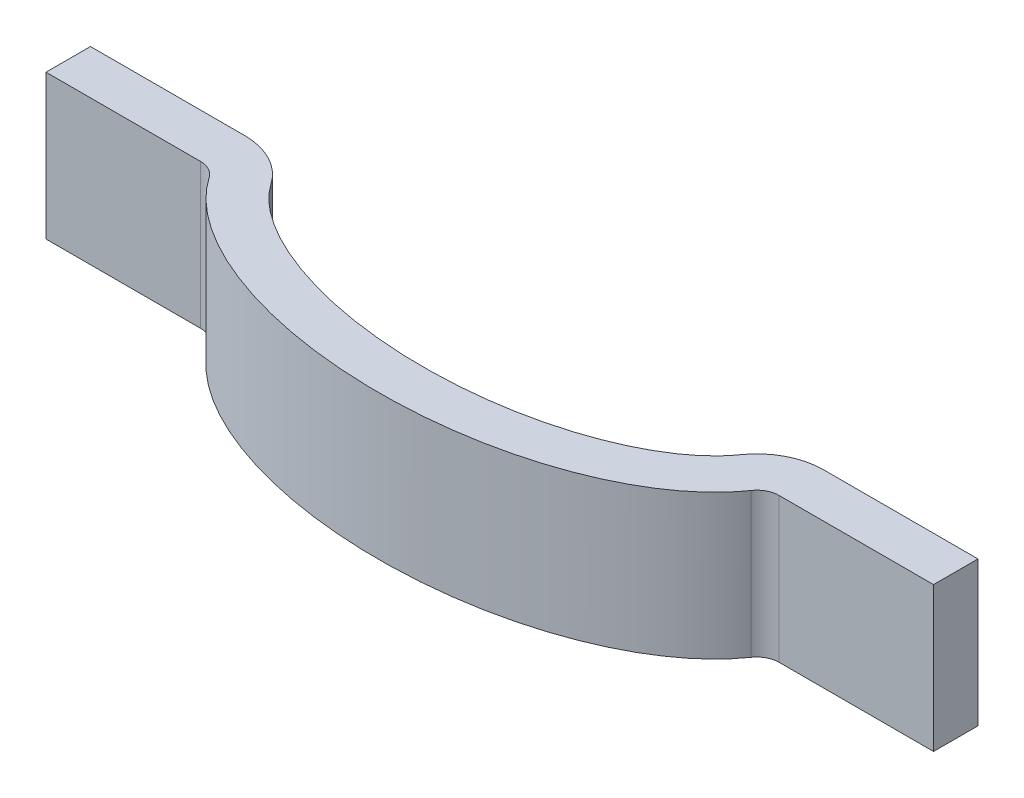
ISO-10303-21;
HEADER;
FILE_DESCRIPTION(('STEP AP214'),'2;1');
FILE_NAME('part.step','',(''),(''),'','','');
FILE_SCHEMA(('AUTOMOTIVE_DESIGN { 1 0 10303 214 1 1 1 1 }'));
ENDSEC;
DATA;
#1=APPLICATION_CONTEXT('core data for automotive mechanical design processes');
#2=APPLICATION_PROTOCOL_DEFINITION('international standard','automotive_design',2000,#1);
#3=PRODUCT_CONTEXT('',#1,'mechanical');
#4=PRODUCT('Part','Part','',(#3));
#5=PRODUCT_RELATED_PRODUCT_CATEGORY('part','',(#4));
#6=PRODUCT_DEFINITION_FORMATION('','',#4);
#7=PRODUCT_DEFINITION_CONTEXT('part definition',#1,'design');
#8=PRODUCT_DEFINITION('design','',#6,#7);
#9=PRODUCT_DEFINITION_SHAPE('','',#8);
#10=(LENGTH_UNIT() NAMED_UNIT(*) SI_UNIT(.MILLI.,.METRE.));
#11=(NAMED_UNIT(*) PLANE_ANGLE_UNIT() SI_UNIT($,.RADIAN.));
#12=(NAMED_UNIT(*) SI_UNIT($,.STERADIAN.) SOLID_ANGLE_UNIT());
#13=UNCERTAINTY_MEASURE_WITH_UNIT(LENGTH_MEASURE(1.E-05),#10,'distance_accuracy_value','');
#14=(GEOMETRIC_REPRESENTATION_CONTEXT(3) GLOBAL_UNCERTAINTY_ASSIGNED_CONTEXT((#13)) GLOBAL_UNIT_ASSIGNED_CONTEXT((#10,
#11,#12)) REPRESENTATION_CONTEXT('',''));
#15=CARTESIAN_POINT('',(0.,0.,0.));
#16=DIRECTION('',(0.,0.,1.));
#17=DIRECTION('',(1.,0.,0.));
#18=AXIS2_PLACEMENT_3D('',#15,#16,#17);
#19=CARTESIAN_POINT('',(16.8897912138371,9.49999999497035,10.9999999950296));
#20=DIRECTION('',(0.,1.,0.));
#21=DIRECTION('',(-1.,0.,0.));
#22=AXIS2_PLACEMENT_3D('',#19,#20,#21);
#23=CYLINDRICAL_SURFACE('',#22,2.);
#24=DIRECTION('',(0.,-1.,0.));
#25=VECTOR('',#24,1.);
#26=CARTESIAN_POINT('',(16.8897912138371,-5.02963642956544E-09,8.99999999502961));
#27=LINE('',#26,#25);
#28=CARTESIAN_POINT('',(16.8897912138371,15.9999999949704,8.99999999502967));
#29=VERTEX_POINT('',#28);
#30=CARTESIAN_POINT('',(16.8897912138371,2.99999999999999,8.99999999502961));
#31=VERTEX_POINT('',#30);
#32=EDGE_CURVE('E183',#29,#31,#27,.T.);
#33=ORIENTED_EDGE('',*,*,#32,.T.);
#34=CARTESIAN_POINT('',(16.8897912138371,2.99999999999999,10.9999999950296));
#35=DIRECTION('',(0.,1.,0.));
#36=DIRECTION('',(-1.,0.,0.));
#37=AXIS2_PLACEMENT_3D('',#34,#35,#36);
#38=CIRCLE('',#37,2.);
#39=CARTESIAN_POINT('',(18.5374581917324,2.99999999999999,9.86633623096491));
#40=VERTEX_POINT('',#39);
#41=EDGE_CURVE('E269',#31,#40,#38,.F.);
#42=ORIENTED_EDGE('',*,*,#41,.T.);
#43=DIRECTION('',(0.,1.,0.));
#44=VECTOR('',#43,1.);
#45=CARTESIAN_POINT('',(18.5374581917217,-5.02965030735325E-09,9.86633623094938));
#46=LINE('',#45,#44);
#47=CARTESIAN_POINT('',(18.5374581917324,15.9999999949704,9.86633623096492));
#48=VERTEX_POINT('',#47);
#49=EDGE_CURVE('E274',#40,#48,#46,.T.);
#50=ORIENTED_EDGE('',*,*,#49,.T.);
#51=CARTESIAN_POINT('',(16.8897912138371,15.9999999949704,10.9999999950297));
#52=DIRECTION('',(0.,-1.,0.));
#53=DIRECTION('',(1.,0.,0.));
#54=AXIS2_PLACEMENT_3D('',#51,#52,#53);
#55=CIRCLE('',#54,2.);
#56=EDGE_CURVE('E192',#48,#29,#55,.F.);
#57=ORIENTED_EDGE('',*,*,#56,.T.);
#58=EDGE_LOOP('',(#33,#42,#50,#57));
#59=FACE_BOUND('',#58,.T.);
#60=ADVANCED_FACE('F37',(#59),#23,.F.);
#61=CARTESIAN_POINT('',(20.91618604,-5.02963642956544E-09,8.99999999502961));
#62=DIRECTION('',(0.,0.,1.));
#63=DIRECTION('',(-1.,0.,0.));
#64=AXIS2_PLACEMENT_3D('',#61,#62,#63);
#65=PLANE('',#64);
#66=DIRECTION('',(-1.,0.,0.));
#67=VECTOR('',#66,1.);
#68=CARTESIAN_POINT('',(20.91618604,2.99999999999999,8.99999999502962));
#69=LINE('',#68,#67);
#70=CARTESIAN_POINT('',(3.,2.99999999999999,8.99999999502964));
#71=VERTEX_POINT('',#70);
#72=EDGE_CURVE('E289',#31,#71,#69,.T.);
#73=ORIENTED_EDGE('',*,*,#72,.F.);
#74=ORIENTED_EDGE('',*,*,#32,.F.);
#75=DIRECTION('',(1.,0.,0.));
#76=VECTOR('',#75,1.);
#77=CARTESIAN_POINT('',(20.91618604,15.9999999949704,8.99999999502967));
#78=LINE('',#77,#76);
#79=CARTESIAN_POINT('',(3.,15.9999999949704,8.99999999502964));
#80=VERTEX_POINT('',#79);
#81=EDGE_CURVE('E58',#80,#29,#78,.T.);
#82=ORIENTED_EDGE('',*,*,#81,.F.);
#83=DIRECTION('',(0.,1.,0.));
#84=VECTOR('',#83,1.);
#85=CARTESIAN_POINT('',(3.,-5.02963523419511E-09,8.99999999502961));
#86=LINE('',#85,#84);
#87=EDGE_CURVE('E44',#71,#80,#86,.T.);
#88=ORIENTED_EDGE('',*,*,#87,.F.);
#89=EDGE_LOOP('',(#73,#74,#82,#88));
#90=FACE_BOUND('',#89,.T.);
#91=ADVANCED_FACE('F258',(#90),#65,.T.);
#92=CARTESIAN_POINT('',(68.9425808661629,9.49999999497035,10.9999999950296));
#93=DIRECTION('',(0.,1.,0.));
#94=DIRECTION('',(-1.,0.,0.));
#95=AXIS2_PLACEMENT_3D('',#92,#93,#94);
#96=CYLINDRICAL_SURFACE('',#95,2.);
#97=DIRECTION('',(0.,1.,0.));
#98=VECTOR('',#97,1.);
#99=CARTESIAN_POINT('',(67.294913888276,-5.02964336845935E-09,9.86633623095261));
#100=LINE('',#99,#98);
#101=CARTESIAN_POINT('',(67.2949138882676,15.9999999949703,9.86633623096491));
#102=VERTEX_POINT('',#101);
#103=CARTESIAN_POINT('',(67.2949138882676,3.,9.86633623096487));
#104=VERTEX_POINT('',#103);
#105=EDGE_CURVE('E197',#102,#104,#100,.F.);
#106=ORIENTED_EDGE('',*,*,#105,.T.);
#107=CARTESIAN_POINT('',(68.9425808661629,3.,10.9999999950296));
#108=DIRECTION('',(0.,1.,0.));
#109=DIRECTION('',(-1.,0.,0.));
#110=AXIS2_PLACEMENT_3D('',#107,#108,#109);
#111=CIRCLE('',#110,2.);
#112=CARTESIAN_POINT('',(68.9425808661629,3.,8.99999999502959));
#113=VERTEX_POINT('',#112);
#114=EDGE_CURVE('E152',#104,#113,#111,.F.);
#115=ORIENTED_EDGE('',*,*,#114,.T.);
#116=DIRECTION('',(0.,-1.,0.));
#117=VECTOR('',#116,1.);
#118=CARTESIAN_POINT('',(68.9425808661629,-5.02963642956544E-09,8.99999999502962));
#119=LINE('',#118,#117);
#120=CARTESIAN_POINT('',(68.9425808661629,15.9999999949703,8.99999999502963));
#121=VERTEX_POINT('',#120);
#122=EDGE_CURVE('E148',#113,#121,#119,.F.);
#123=ORIENTED_EDGE('',*,*,#122,.T.);
#124=CARTESIAN_POINT('',(68.9425808661629,15.9999999949703,10.9999999950296));
#125=DIRECTION('',(0.,-1.,0.));
#126=DIRECTION('',(1.,0.,0.));
#127=AXIS2_PLACEMENT_3D('',#124,#125,#126);
#128=CIRCLE('',#127,2.);
#129=EDGE_CURVE('E129',#121,#102,#128,.F.);
#130=ORIENTED_EDGE('',*,*,#129,.T.);
#131=EDGE_LOOP('',(#106,#115,#123,#130));
#132=FACE_BOUND('',#131,.T.);
#133=ADVANCED_FACE('F263',(#132),#96,.F.);
#134=CARTESIAN_POINT('',(64.91618604,-5.02963642956544E-09,8.99999999502962));
#135=DIRECTION('',(0.,0.,1.));
#136=DIRECTION('',(-1.,0.,0.));
#137=AXIS2_PLACEMENT_3D('',#134,#135,#136);
#138=PLANE('',#137);
#139=DIRECTION('',(-1.,0.,0.));
#140=VECTOR('',#139,1.);
#141=CARTESIAN_POINT('',(64.91618604,3.,8.99999999502963));
#142=LINE('',#141,#140);
#143=CARTESIAN_POINT('',(82.8323720749977,3.,8.99999999502965));
#144=VERTEX_POINT('',#143);
#145=EDGE_CURVE('E147',#144,#113,#142,.T.);
#146=ORIENTED_EDGE('',*,*,#145,.F.);
#147=DIRECTION('',(0.,-1.,0.));
#148=VECTOR('',#147,1.);
#149=CARTESIAN_POINT('',(82.8323720749977,-5.02963642956544E-09,8.99999999502961));
#150=LINE('',#149,#148);
#151=CARTESIAN_POINT('',(82.8323720749977,15.9999999949704,8.99999999502967));
#152=VERTEX_POINT('',#151);
#153=EDGE_CURVE('E11',#152,#144,#150,.T.);
#154=ORIENTED_EDGE('',*,*,#153,.F.);
#155=DIRECTION('',(1.,0.,0.));
#156=VECTOR('',#155,1.);
#157=CARTESIAN_POINT('',(64.91618604,15.9999999949703,8.99999999502967));
#158=LINE('',#157,#156);
#159=EDGE_CURVE('E123',#121,#152,#158,.T.);
#160=ORIENTED_EDGE('',*,*,#159,.F.);
#161=ORIENTED_EDGE('',*,*,#122,.F.);
#162=EDGE_LOOP('',(#146,#154,#160,#161));
#163=FACE_BOUND('',#162,.T.);
#164=ADVANCED_FACE('F146',(#163),#138,.T.);
#165=CARTESIAN_POINT('',(20.91618604,-5.02962255177763E-09,4.99999999502961));
#166=CARTESIAN_POINT('',(20.91618604,-5.02962255177763E-09,5.43203663686933));
#167=CARTESIAN_POINT('',(21.0612996780334,-5.02962255177763E-09,6.29610992054875));
#168=CARTESIAN_POINT('',(21.9187981969256,-5.02963642956544E-09,7.88664464208802));
#169=CARTESIAN_POINT('',(23.6581810932833,-5.02964336845935E-09,9.6693867916077));
#170=CARTESIAN_POINT('',(27.1749338723224,-5.02965030735325E-09,11.9987857519427));
#171=CARTESIAN_POINT('',(33.5518250020295,-5.02965724624715E-09,14.3281522537659));
#172=CARTESIAN_POINT('',(42.91618604,-5.02966418514106E-09,15.3359238656615));
#173=CARTESIAN_POINT('',(52.2805470779705,-5.02966418514106E-09,14.3281522537659));
#174=CARTESIAN_POINT('',(58.6574382076776,-5.02965030735325E-09,11.9987857519427));
#175=CARTESIAN_POINT('',(62.1741909867167,-5.02963642956544E-09,9.6693867916077));
#176=CARTESIAN_POINT('',(63.9135738830744,-5.02963642956544E-09,7.88664464208802));
#177=CARTESIAN_POINT('',(64.7710724019666,-5.02962255177763E-09,6.29610992054875));
#178=CARTESIAN_POINT('',(64.91618604,-5.02962255177763E-09,5.43203663686933));
#179=CARTESIAN_POINT('',(64.91618604,-5.02962255177763E-09,4.99999999502962));
#180=B_SPLINE_CURVE_WITH_KNOTS('',3,(#165,#166,#167,#168,#169,#170,#171,#172,#173,#174,#175,
#176,#177,#178,#179),.UNSPECIFIED.,.F.,.F.,(4,1,1,1,1,1,1,1,1,1,1,1,4),(3.14159265358979,
3.33794219443916,3.53429173528852,3.73064127613788,3.92699081698724,4.31968989868597,
4.71238898038469,5.10508806208341,5.49778714378214,5.6941366846315,5.89048622548086,
6.08683576633022,6.28318530717959),.UNSPECIFIED.);
#181=DIRECTION('',(0.,1.,0.));
#182=VECTOR('',#181,1.);
#183=SURFACE_OF_LINEAR_EXTRUSION('',#180,#182);
#184=OFFSET_SURFACE('',#183,4.,.F.);
#185=CARTESIAN_POINT('',(67.2949138882676,3.,9.86633623096487));
#186=CARTESIAN_POINT('',(67.1684440931066,3.,10.0502030135455));
#187=CARTESIAN_POINT('',(67.0363906796709,3.,10.2301440314707));
#188=CARTESIAN_POINT('',(66.7626468408219,3.,10.5820103308421));
#189=CARTESIAN_POINT('',(66.620974997312,3.,10.7539500441448));
#190=CARTESIAN_POINT('',(66.3291127520982,3.,11.0902550530924));
#191=CARTESIAN_POINT('',(66.1789266630438,3.,11.2546241083053));
#192=CARTESIAN_POINT('',(65.8724313172399,3.,11.5746100408212));
#193=CARTESIAN_POINT('',(65.7161921280537,3.,11.7302941816732));
#194=CARTESIAN_POINT('',(65.3970483231909,3.,12.0348203377828));
#195=CARTESIAN_POINT('',(65.2341405097192,3.,12.1836589960406));
#196=CARTESIAN_POINT('',(64.9023845100024,3.,12.4746420649206));
#197=CARTESIAN_POINT('',(64.7335345581745,3.,12.6167844560413));
#198=CARTESIAN_POINT('',(64.2514464556864,3.,13.0071405144468));
#199=CARTESIAN_POINT('',(63.9321481771395,3.,13.2479047347508));
#200=CARTESIAN_POINT('',(63.2795117624317,3.,13.7097134978813));
#201=CARTESIAN_POINT('',(62.9461676914851,3.,13.9307495794251));
#202=CARTESIAN_POINT('',(62.2679411757094,3.,14.3543866724914));
#203=CARTESIAN_POINT('',(61.9230574555743,3.,14.5569856371685));
#204=CARTESIAN_POINT('',(61.2210471929346,3.,14.9460497469424));
#205=CARTESIAN_POINT('',(60.8638496371084,3.,15.1323862668058));
#206=CARTESIAN_POINT('',(60.1414727278882,3.,15.4886168930814));
#207=CARTESIAN_POINT('',(59.776295065123,3.,15.6585144415647));
#208=CARTESIAN_POINT('',(59.0392700343087,3.,15.9832339756128));
#209=CARTESIAN_POINT('',(58.6674218096528,3.,16.1380540083331));
#210=CARTESIAN_POINT('',(57.7995477412056,3.,16.4803684463789));
#211=CARTESIAN_POINT('',(57.3014785566919,3.,16.6626897441269));
#212=CARTESIAN_POINT('',(56.2975311155487,3.,17.0045725848523));
#213=CARTESIAN_POINT('',(55.7916513731083,3.,17.1641297367609));
#214=CARTESIAN_POINT('',(54.7733151560886,3.,17.4616716407113));
#215=CARTESIAN_POINT('',(54.2608555736741,3.,17.5996457600311));
#216=CARTESIAN_POINT('',(53.4883395046693,3.,17.7909046867859));
#217=CARTESIAN_POINT('',(53.2301992293896,3.,17.8520400335823));
#218=CARTESIAN_POINT('',(52.7127456594417,3.,17.9691327831594));
#219=CARTESIAN_POINT('',(52.4534323617423,3.,18.0250901725522));
#220=CARTESIAN_POINT('',(51.6740585073555,3.,18.1854080267874));
#221=CARTESIAN_POINT('',(51.1524350318748,3.,18.28224593991));
#222=CARTESIAN_POINT('',(50.1060220544663,3.,18.4569080901237));
#223=CARTESIAN_POINT('',(49.5812324335895,3.,18.5347316082456));
#224=CARTESIAN_POINT('',(48.5293945254812,3.,18.6720785690793));
#225=CARTESIAN_POINT('',(48.0023467968509,3.,18.7316062995037));
#226=CARTESIAN_POINT('',(46.9465469458277,3.,18.8328564322404));
#227=CARTESIAN_POINT('',(46.417794836107,3.,18.8745789666297));
#228=CARTESIAN_POINT('',(45.5109740706491,3.,18.9309977924382));
#229=CARTESIAN_POINT('',(45.1331678550092,3.,18.9500130778416));
#230=CARTESIAN_POINT('',(44.3772180544103,3.,18.9791119253451));
#231=CARTESIAN_POINT('',(43.9990744785194,3.,18.9891957206831));
#232=CARTESIAN_POINT('',(43.2426266175703,3.,19.000374274344));
#233=CARTESIAN_POINT('',(42.8643223226806,3.,19.0014683665954));
#234=CARTESIAN_POINT('',(42.1077931008588,3.,18.9946425532552));
#235=CARTESIAN_POINT('',(41.7295681745753,3.,18.9867225766493));
#236=CARTESIAN_POINT('',(40.9733081320334,3.,18.9619440114931));
#237=CARTESIAN_POINT('',(40.5952730923841,3.,18.9450830605258));
#238=CARTESIAN_POINT('',(39.8397210572341,3.,18.9024129697075));
#239=CARTESIAN_POINT('',(39.4622040612316,3.,18.8766038385317));
#240=CARTESIAN_POINT('',(38.3322142249044,3.,18.7858088329513));
#241=CARTESIAN_POINT('',(37.5807477058313,3.,18.7074046774618));
#242=CARTESIAN_POINT('',(36.4573039340414,3.,18.5620741999557));
#243=CARTESIAN_POINT('',(36.0834720531697,3.,18.5090142055376));
#244=CARTESIAN_POINT('',(35.337266261916,3.,18.3933823845907));
#245=CARTESIAN_POINT('',(34.9648923580415,3.,18.3308105156573));
#246=CARTESIAN_POINT('',(34.2220947907623,3.,18.1958780133701));
#247=CARTESIAN_POINT('',(33.8516703253949,2.99999999999999,18.1235217961705));
#248=CARTESIAN_POINT('',(33.1129730195451,2.99999999999999,17.9685575512248));
#249=CARTESIAN_POINT('',(32.7447001364086,2.99999999999999,17.8859497274393));
#250=CARTESIAN_POINT('',(32.0686314967826,2.99999999999999,17.7240461221481));
#251=CARTESIAN_POINT('',(31.7604675275647,2.99999999999999,17.6462866528733));
#252=CARTESIAN_POINT('',(31.1461648461952,2.99999999999999,17.4831656550781));
#253=CARTESIAN_POINT('',(30.8400261260857,2.99999999999999,17.3978041564476));
#254=CARTESIAN_POINT('',(29.9250030969704,2.99999999999999,17.1300491601522));
#255=CARTESIAN_POINT('',(29.3194857725492,2.99999999999999,16.9359789373812));
#256=CARTESIAN_POINT('',(28.1193664685582,2.99999999999999,16.5144629301057));
#257=CARTESIAN_POINT('',(27.5247766758037,2.99999999999999,16.2869821580386));
#258=CARTESIAN_POINT('',(26.6444219391632,2.99999999999999,15.9184749630105));
#259=CARTESIAN_POINT('',(26.3529043883624,2.99999999999999,15.7910976627161));
#260=CARTESIAN_POINT('',(25.7742809160311,2.99999999999999,15.5266732937783));
#261=CARTESIAN_POINT('',(25.4871747874601,2.99999999999999,15.3896266806417));
#262=CARTESIAN_POINT('',(24.986079454977,2.99999999999999,15.1391845810809));
#263=CARTESIAN_POINT('',(24.7710047073359,2.99999999999999,15.0279579324538));
#264=CARTESIAN_POINT('',(24.3442429945969,2.99999999999999,14.7991804642747));
#265=CARTESIAN_POINT('',(24.1325559720853,2.99999999999999,14.681629752048));
#266=CARTESIAN_POINT('',(23.7128984861939,2.99999999999999,14.4399850157551));
#267=CARTESIAN_POINT('',(23.5049286546783,2.99999999999999,14.3158898931417));
#268=CARTESIAN_POINT('',(23.0931650592438,2.99999999999999,14.0609468096725));
#269=CARTESIAN_POINT('',(22.8893713121394,2.99999999999999,13.9300988216346));
#270=CARTESIAN_POINT('',(22.4874086234861,2.99999999999999,13.6620019360083));
#271=CARTESIAN_POINT('',(22.2892176950368,2.99999999999999,13.524786120459));
#272=CARTESIAN_POINT('',(21.8980811661594,2.99999999999999,13.2430954268313));
#273=CARTESIAN_POINT('',(21.7051357015843,2.99999999999999,13.0986203610198));
#274=CARTESIAN_POINT('',(21.1354199303817,2.99999999999999,12.6537953527266));
#275=CARTESIAN_POINT('',(20.767475547945,2.99999999999999,12.3418515561697));
#276=CARTESIAN_POINT('',(20.2409300098414,2.99999999999999,11.8517608390854));
#277=CARTESIAN_POINT('',(20.0707403664345,2.99999999999999,11.6859289569286));
#278=CARTESIAN_POINT('',(19.738792765326,2.99999999999999,11.346097215661));
#279=CARTESIAN_POINT('',(19.5770319678337,2.99999999999999,11.1721001455553));
#280=CARTESIAN_POINT('',(19.2623123002156,2.99999999999999,10.8147341263391));
#281=CARTESIAN_POINT('',(19.1094014988301,2.99999999999999,10.6313226567127));
#282=CARTESIAN_POINT('',(18.8146771516958,2.99999999999999,10.2555603950001));
#283=CARTESIAN_POINT('',(18.6728729416345,2.99999999999999,10.0632022947002));
#284=CARTESIAN_POINT('',(18.5374581917324,2.99999999999999,9.86633623096489));
#285=B_SPLINE_CURVE_WITH_KNOTS('',3,(#185,#186,#187,#188,#189,#190,#191,#192,#193,#194,#195,
#196,#197,#198,#199,#200,#201,#202,#203,#204,#205,#206,#207,#208,#209,#210,#211,#212,#213,#214,
#215,#216,#217,#218,#219,#220,#221,#222,#223,#224,#225,#226,#227,#228,#229,#230,#231,#232,#233,
#234,#235,#236,#237,#238,#239,#240,#241,#242,#243,#244,#245,#246,#247,#248,#249,#250,#251,#252,
#253,#254,#255,#256,#257,#258,#259,#260,#261,#262,#263,#264,#265,#266,#267,#268,#269,#270,#271,
#272,#273,#274,#275,#276,#277,#278,#279,#280,#281,#282,#283,#284),.UNSPECIFIED.,.F.,.F.,(4,2,2,
2,2,2,2,2,2,2,2,2,2,2,2,2,2,2,2,2,2,2,2,2,2,2,2,2,2,2,2,2,2,2,2,2,2,2,2,2,2,2,2,2,2,2,2,2,2,4),
(0.,0.669281806984418,1.33730552325058,2.00499384289205,2.66646274120828,3.32825263621456,
3.99024085666846,5.18901225671086,6.38829535658677,7.58771143603576,8.79588651027868,
10.003808061059,11.211885854719,12.8024289014461,14.3932783408854,15.9849090490023,
16.7807068771558,17.5765067628298,19.1677083788796,20.7589701518634,22.349858719549,
23.9407354859981,25.0754911165634,26.210217113122,27.3450271838467,28.4798461948418,
29.6149652014029,30.7500831074906,33.0156563363389,34.1483005989663,35.2809499111618,
36.4130896992206,37.5452069664283,38.4985792432365,39.4519477717131,41.3586042894407,
43.2672718873329,44.2215230770731,45.1757293434572,45.9020350132949,46.6283283609372,
47.3547440149406,48.0811625931855,48.8041567891258,49.5271696922066,50.9721395653798,
51.6847852079455,52.3971891772918,53.1131561977558,53.8297187086723),.UNSPECIFIED.);
#286=EDGE_CURVE('E156',#104,#40,#285,.T.);
#287=ORIENTED_EDGE('',*,*,#286,.F.);
#288=ORIENTED_EDGE('',*,*,#105,.F.);
#289=CARTESIAN_POINT('',(18.5374581917324,15.9999999949704,9.86633623096493));
#290=CARTESIAN_POINT('',(18.6639279868934,15.9999999949704,10.0502030135455));
#291=CARTESIAN_POINT('',(18.7959814003291,15.9999999949704,10.2301440314708));
#292=CARTESIAN_POINT('',(19.0697252391781,15.9999999949704,10.5820103308422));
#293=CARTESIAN_POINT('',(19.211397082688,15.9999999949704,10.7539500441449));
#294=CARTESIAN_POINT('',(19.5032593279019,15.9999999949704,11.0902550530925));
#295=CARTESIAN_POINT('',(19.6534454169562,15.9999999949704,11.2546241083054));
#296=CARTESIAN_POINT('',(19.9599407627601,15.9999999949704,11.5746100408213));
#297=CARTESIAN_POINT('',(20.1161799519464,15.9999999949704,11.7302941816733));
#298=CARTESIAN_POINT('',(20.4353237568092,15.9999999949704,12.0348203377829));
#299=CARTESIAN_POINT('',(20.5982315702808,15.9999999949704,12.1836589960407));
#300=CARTESIAN_POINT('',(20.9299875699977,15.9999999949704,12.4746420649207));
#301=CARTESIAN_POINT('',(21.0988375218255,15.9999999949704,12.6167844560414));
#302=CARTESIAN_POINT('',(21.5809256243136,15.9999999949704,13.0071405144469));
#303=CARTESIAN_POINT('',(21.9002239028605,15.9999999949704,13.2479047347509));
#304=CARTESIAN_POINT('',(22.5528603175683,15.9999999949704,13.7097134978814));
#305=CARTESIAN_POINT('',(22.8862043885149,15.9999999949704,13.9307495794252));
#306=CARTESIAN_POINT('',(23.5644309042907,15.9999999949704,14.3543866724915));
#307=CARTESIAN_POINT('',(23.9093146244258,15.9999999949704,14.5569856371686));
#308=CARTESIAN_POINT('',(24.6113248870654,15.9999999949704,14.9460497469425));
#309=CARTESIAN_POINT('',(24.9685224428917,15.9999999949704,15.1323862668059));
#310=CARTESIAN_POINT('',(25.6908993521119,15.9999999949704,15.4886168930815));
#311=CARTESIAN_POINT('',(26.0560770148771,15.9999999949704,15.6585144415648));
#312=CARTESIAN_POINT('',(26.7931020456914,15.9999999949704,15.9832339756129));
#313=CARTESIAN_POINT('',(27.1649502703472,15.9999999949704,16.1380540083331));
#314=CARTESIAN_POINT('',(28.0328243387945,15.9999999949704,16.480368446379));
#315=CARTESIAN_POINT('',(28.5308935233082,15.9999999949704,16.662689744127));
#316=CARTESIAN_POINT('',(29.5348409644515,15.9999999949704,17.0045725848524));
#317=CARTESIAN_POINT('',(30.0407207068918,15.9999999949704,17.164129736761));
#318=CARTESIAN_POINT('',(31.0590569239116,15.9999999949704,17.4616716407113));
#319=CARTESIAN_POINT('',(31.571516506326,15.9999999949704,17.5996457600312));
#320=CARTESIAN_POINT('',(32.3440325753309,15.9999999949704,17.790904686786));
#321=CARTESIAN_POINT('',(32.6021728506105,15.9999999949704,17.8520400335823));
#322=CARTESIAN_POINT('',(33.1196264205585,15.9999999949704,17.9691327831594));
#323=CARTESIAN_POINT('',(33.3789397182578,15.9999999949704,18.0250901725523));
#324=CARTESIAN_POINT('',(34.1583135726446,15.9999999949704,18.1854080267875));
#325=CARTESIAN_POINT('',(34.6799370481254,15.9999999949704,18.2822459399101));
#326=CARTESIAN_POINT('',(35.7263500255338,15.9999999949704,18.4569080901238));
#327=CARTESIAN_POINT('',(36.2511396464107,15.9999999949704,18.5347316082457));
#328=CARTESIAN_POINT('',(37.302977554519,15.9999999949704,18.6720785690793));
#329=CARTESIAN_POINT('',(37.8300252831492,15.9999999949704,18.7316062995037));
#330=CARTESIAN_POINT('',(38.8858251341724,15.9999999949704,18.8328564322405));
#331=CARTESIAN_POINT('',(39.4145772438932,15.9999999949704,18.8745789666298));
#332=CARTESIAN_POINT('',(40.3213980093511,15.9999999949704,18.9309977924382));
#333=CARTESIAN_POINT('',(40.699204224991,15.9999999949704,18.9500130778417));
#334=CARTESIAN_POINT('',(41.4551540255898,15.9999999949704,18.9791119253451));
#335=CARTESIAN_POINT('',(41.8332976014808,15.9999999949704,18.9891957206831));
#336=CARTESIAN_POINT('',(42.5897454624299,15.9999999949704,19.000374274344));
#337=CARTESIAN_POINT('',(42.9680497573195,15.9999999949704,19.0014683665955));
#338=CARTESIAN_POINT('',(43.7245789791414,15.9999999949704,18.9946425532552));
#339=CARTESIAN_POINT('',(44.1028039054249,15.9999999949704,18.9867225766493));
#340=CARTESIAN_POINT('',(44.8590639479668,15.9999999949704,18.9619440114932));
#341=CARTESIAN_POINT('',(45.2370989876162,15.9999999949704,18.9450830605258));
#342=CARTESIAN_POINT('',(45.9926510227661,15.9999999949704,18.9024129697075));
#343=CARTESIAN_POINT('',(46.3701680187686,15.9999999949704,18.8766038385317));
#344=CARTESIAN_POINT('',(47.5001578550959,15.9999999949704,18.7858088329513));
#345=CARTESIAN_POINT('',(48.251624374169,15.9999999949704,18.7074046774618));
#346=CARTESIAN_POINT('',(49.3750681459588,15.9999999949704,18.5620741999557));
#347=CARTESIAN_POINT('',(49.7489000268305,15.9999999949704,18.5090142055376));
#348=CARTESIAN_POINT('',(50.4951058180842,15.9999999949704,18.3933823845907));
#349=CARTESIAN_POINT('',(50.8674797219588,15.9999999949704,18.3308105156573));
#350=CARTESIAN_POINT('',(51.6102772892379,15.9999999949704,18.1958780133701));
#351=CARTESIAN_POINT('',(51.9807017546054,15.9999999949704,18.1235217961705));
#352=CARTESIAN_POINT('',(52.7193990604552,15.9999999949704,17.9685575512247));
#353=CARTESIAN_POINT('',(53.0876719435916,15.9999999949704,17.8859497274392));
#354=CARTESIAN_POINT('',(53.7637405832177,15.9999999949704,17.7240461221481));
#355=CARTESIAN_POINT('',(54.0719045524356,15.9999999949704,17.6462866528732));
#356=CARTESIAN_POINT('',(54.6862072338051,15.9999999949704,17.483165655078));
#357=CARTESIAN_POINT('',(54.9923459539146,15.9999999949703,17.3978041564475));
#358=CARTESIAN_POINT('',(55.9073689830299,15.9999999949703,17.1300491601521));
#359=CARTESIAN_POINT('',(56.5128863074511,15.9999999949703,16.9359789373812));
#360=CARTESIAN_POINT('',(57.7130056114421,15.9999999949703,16.5144629301056));
#361=CARTESIAN_POINT('',(58.3075954041965,15.9999999949703,16.2869821580385));
#362=CARTESIAN_POINT('',(59.1879501408371,15.9999999949703,15.9184749630104));
#363=CARTESIAN_POINT('',(59.4794676916379,15.9999999949703,15.791097662716));
#364=CARTESIAN_POINT('',(60.0580911639692,15.9999999949703,15.5266732937782));
#365=CARTESIAN_POINT('',(60.3451972925402,15.9999999949703,15.3896266806416));
#366=CARTESIAN_POINT('',(60.8462926250233,15.9999999949703,15.1391845810808));
#367=CARTESIAN_POINT('',(61.0613673726644,15.9999999949703,15.0279579324537));
#368=CARTESIAN_POINT('',(61.4881290854034,15.9999999949703,14.7991804642746));
#369=CARTESIAN_POINT('',(61.699816107915,15.9999999949703,14.6816297520478));
#370=CARTESIAN_POINT('',(62.1194735938064,15.9999999949703,14.439985015755));
#371=CARTESIAN_POINT('',(62.3274434253219,15.9999999949703,14.3158898931415));
#372=CARTESIAN_POINT('',(62.7392070207564,15.9999999949703,14.0609468096723));
#373=CARTESIAN_POINT('',(62.9430007678608,15.9999999949703,13.9300988216345));
#374=CARTESIAN_POINT('',(63.3449634565141,15.9999999949703,13.6620019360082));
#375=CARTESIAN_POINT('',(63.5431543849634,15.9999999949703,13.5247861204589));
#376=CARTESIAN_POINT('',(63.9342909138408,15.9999999949703,13.2430954268311));
#377=CARTESIAN_POINT('',(64.1272363784159,15.9999999949703,13.0986203610196));
#378=CARTESIAN_POINT('',(64.6969521496185,15.9999999949703,12.6537953527265));
#379=CARTESIAN_POINT('',(65.0648965320551,15.9999999949703,12.3418515561695));
#380=CARTESIAN_POINT('',(65.5914420701588,15.9999999949703,11.8517608390852));
#381=CARTESIAN_POINT('',(65.7616317135656,15.9999999949703,11.6859289569285));
#382=CARTESIAN_POINT('',(66.0935793146741,15.9999999949703,11.3460972156609));
#383=CARTESIAN_POINT('',(66.2553401121664,15.9999999949703,11.1721001455552));
#384=CARTESIAN_POINT('',(66.5700597797844,15.9999999949703,10.814734126339));
#385=CARTESIAN_POINT('',(66.7229705811699,15.9999999949703,10.6313226567127));
#386=CARTESIAN_POINT('',(67.0176949283042,15.9999999949703,10.2555603950002));
#387=CARTESIAN_POINT('',(67.1594991383654,15.9999999949703,10.0632022947002));
#388=CARTESIAN_POINT('',(67.2949138882676,15.9999999949703,9.86633623096498));
#389=B_SPLINE_CURVE_WITH_KNOTS('',3,(#289,#290,#291,#292,#293,#294,#295,#296,#297,#298,#299,
#300,#301,#302,#303,#304,#305,#306,#307,#308,#309,#310,#311,#312,#313,#314,#315,#316,#317,#318,
#319,#320,#321,#322,#323,#324,#325,#326,#327,#328,#329,#330,#331,#332,#333,#334,#335,#336,#337,
#338,#339,#340,#341,#342,#343,#344,#345,#346,#347,#348,#349,#350,#351,#352,#353,#354,#355,#356,
#357,#358,#359,#360,#361,#362,#363,#364,#365,#366,#367,#368,#369,#370,#371,#372,#373,#374,#375,
#376,#377,#378,#379,#380,#381,#382,#383,#384,#385,#386,#387,#388),.UNSPECIFIED.,.F.,.F.,(4,2,2,
2,2,2,2,2,2,2,2,2,2,2,2,2,2,2,2,2,2,2,2,2,2,2,2,2,2,2,2,2,2,2,2,2,2,2,2,2,2,2,2,2,2,2,2,2,2,4),
(0.,0.66928180698443,1.33730552325061,2.00499384289208,2.66646274120832,3.32825263621462,
3.99024085666853,5.18901225671091,6.38829535658684,7.58771143603583,8.79588651027875,
10.0038080610591,11.2118858547191,12.8024289014462,14.3932783408855,15.9849090490024,
16.780706877156,17.5765067628299,19.1677083788798,20.7589701518636,22.3498587195491,
23.9407354859983,25.0754911165636,26.2102171131222,27.3450271838469,28.479846194842,
29.6149652014032,30.7500831074908,33.0156563363391,34.1483005989665,35.2809499111621,
36.4130896992208,37.5452069664286,38.4985792432368,39.4519477717134,41.358604289441,
43.2672718873332,44.2215230770734,45.1757293434575,45.9020350132952,46.6283283609375,
47.3547440149409,48.0811625931857,48.8041567891261,49.5271696922068,50.97213956538,
51.6847852079457,52.3971891772919,53.1131561977558,53.8297187086723),.UNSPECIFIED.);
#390=EDGE_CURVE('E225',#48,#102,#389,.T.);
#391=ORIENTED_EDGE('',*,*,#390,.F.);
#392=ORIENTED_EDGE('',*,*,#49,.F.);
#393=EDGE_LOOP('',(#287,#288,#391,#392));
#394=FACE_BOUND('',#393,.T.);
#395=ADVANCED_FACE('F212',(#394),#184,.T.);
#396=CARTESIAN_POINT('',(82.8323720749977,15.9999999949704,4.99999999502958));
#397=DIRECTION('',(-1.,0.,0.));
#398=DIRECTION('',(0.,0.,1.));
#399=AXIS2_PLACEMENT_3D('',#396,#397,#398);
#400=PLANE('',#399);
#401=DIRECTION('',(0.,0.,-1.));
#402=VECTOR('',#401,1.);
#403=CARTESIAN_POINT('',(82.8323720749977,15.9999999949704,4.99999999502958));
#404=LINE('',#403,#402);
#405=CARTESIAN_POINT('',(82.8323720749977,15.9999999949704,4.99999999502967));
#406=VERTEX_POINT('',#405);
#407=EDGE_CURVE('E126',#152,#406,#404,.T.);
#408=ORIENTED_EDGE('',*,*,#407,.F.);
#409=ORIENTED_EDGE('',*,*,#153,.T.);
#410=DIRECTION('',(0.,0.,-1.));
#411=VECTOR('',#410,1.);
#412=CARTESIAN_POINT('',(82.8323720749977,3.,4.99999999502958));
#413=LINE('',#412,#411);
#414=CARTESIAN_POINT('',(82.8323720749977,3.,4.99999999502965));
#415=VERTEX_POINT('',#414);
#416=EDGE_CURVE('E142',#144,#415,#413,.T.);
#417=ORIENTED_EDGE('',*,*,#416,.T.);
#418=DIRECTION('',(0.,-1.,0.));
#419=VECTOR('',#418,1.);
#420=CARTESIAN_POINT('',(82.8323720749977,-5.02962255177763E-09,4.99999999502962));
#421=LINE('',#420,#419);
#422=EDGE_CURVE('E141',#406,#415,#421,.T.);
#423=ORIENTED_EDGE('',*,*,#422,.F.);
#424=EDGE_LOOP('',(#408,#409,#417,#423));
#425=FACE_BOUND('',#424,.T.);
#426=ADVANCED_FACE('F137',(#425),#400,.F.);
#427=CARTESIAN_POINT('',(3.,2.99999999999999,4.99999999502958));
#428=DIRECTION('',(1.,0.,0.));
#429=DIRECTION('',(0.,1.,0.));
#430=AXIS2_PLACEMENT_3D('',#427,#428,#429);
#431=PLANE('',#430);
#432=DIRECTION('',(0.,0.,-1.));
#433=VECTOR('',#432,1.);
#434=CARTESIAN_POINT('',(3.,2.99999999999999,4.99999999502958));
#435=LINE('',#434,#433);
#436=CARTESIAN_POINT('',(3.,2.99999999999999,4.99999999502965));
#437=VERTEX_POINT('',#436);
#438=EDGE_CURVE('E283',#71,#437,#435,.T.);
#439=ORIENTED_EDGE('',*,*,#438,.F.);
#440=ORIENTED_EDGE('',*,*,#87,.T.);
#441=DIRECTION('',(0.,0.,-1.));
#442=VECTOR('',#441,1.);
#443=CARTESIAN_POINT('',(3.,15.9999999949704,4.99999999502958));
#444=LINE('',#443,#442);
#445=CARTESIAN_POINT('',(3.,15.9999999949704,4.99999999502965));
#446=VERTEX_POINT('',#445);
#447=EDGE_CURVE('E143',#80,#446,#444,.T.);
#448=ORIENTED_EDGE('',*,*,#447,.T.);
#449=DIRECTION('',(0.,1.,0.));
#450=VECTOR('',#449,1.);
#451=CARTESIAN_POINT('',(3.,-5.02962135640731E-09,4.99999999502961));
#452=LINE('',#451,#450);
#453=EDGE_CURVE('E175',#437,#446,#452,.T.);
#454=ORIENTED_EDGE('',*,*,#453,.F.);
#455=EDGE_LOOP('',(#439,#440,#448,#454));
#456=FACE_BOUND('',#455,.T.);
#457=ADVANCED_FACE('F238',(#456),#431,.F.);
#458=CARTESIAN_POINT('',(82.8323720749977,3.,4.99999999502958));
#459=DIRECTION('',(0.,1.,0.));
#460=DIRECTION('',(-1.,0.,0.));
#461=AXIS2_PLACEMENT_3D('',#458,#459,#460);
#462=PLANE('',#461);
#463=ORIENTED_EDGE('',*,*,#416,.F.);
#464=ORIENTED_EDGE('',*,*,#145,.T.);
#465=ORIENTED_EDGE('',*,*,#114,.F.);
#466=ORIENTED_EDGE('',*,*,#286,.T.);
#467=ORIENTED_EDGE('',*,*,#41,.F.);
#468=ORIENTED_EDGE('',*,*,#72,.T.);
#469=ORIENTED_EDGE('',*,*,#438,.T.);
#470=DIRECTION('',(-1.,0.,0.));
#471=VECTOR('',#470,1.);
#472=CARTESIAN_POINT('',(20.91618604,2.99999999999999,4.99999999502962));
#473=LINE('',#472,#471);
#474=CARTESIAN_POINT('',(16.8897912138371,2.99999999999999,4.99999999502961));
#475=VERTEX_POINT('',#474);
#476=EDGE_CURVE('E154',#475,#437,#473,.T.);
#477=ORIENTED_EDGE('',*,*,#476,.F.);
#478=CARTESIAN_POINT('',(16.8897912138371,2.99999999999999,10.9999999950296));
#479=DIRECTION('',(0.,1.,0.));
#480=DIRECTION('',(-1.,0.,0.));
#481=AXIS2_PLACEMENT_3D('',#478,#479,#480);
#482=CIRCLE('',#481,6.);
#483=CARTESIAN_POINT('',(21.832792147523,2.99999999999999,7.59900870283549));
#484=VERTEX_POINT('',#483);
#485=EDGE_CURVE('E151',#475,#484,#482,.F.);
#486=ORIENTED_EDGE('',*,*,#485,.T.);
#487=CARTESIAN_POINT('',(20.91618604,3.00000000000001,4.99999999502962));
#488=CARTESIAN_POINT('',(20.91618604,3.00000000000001,5.43203663686934));
#489=CARTESIAN_POINT('',(21.0612996780334,3.00000000000001,6.29610992054876));
#490=CARTESIAN_POINT('',(21.9187981969256,2.99999999999999,7.88664464208803));
#491=CARTESIAN_POINT('',(23.6581810932833,2.99999999999999,9.66938679160771));
#492=CARTESIAN_POINT('',(27.1749338723224,2.99999999999998,11.9987857519427));
#493=CARTESIAN_POINT('',(33.5518250020295,2.99999999999997,14.3281522537659));
#494=CARTESIAN_POINT('',(42.91618604,2.99999999999997,15.3359238656615));
#495=CARTESIAN_POINT('',(52.2805470779705,2.99999999999997,14.3281522537659));
#496=CARTESIAN_POINT('',(58.6574382076776,2.99999999999998,11.9987857519427));
#497=CARTESIAN_POINT('',(62.1741909867167,2.99999999999999,9.66938679160771));
#498=CARTESIAN_POINT('',(63.9135738830744,2.99999999999999,7.88664464208803));
#499=CARTESIAN_POINT('',(64.7710724019666,3.00000000000001,6.29610992054876));
#500=CARTESIAN_POINT('',(64.91618604,3.00000000000001,5.43203663686934));
#501=CARTESIAN_POINT('',(64.91618604,3.00000000000001,4.99999999502963));
#502=B_SPLINE_CURVE_WITH_KNOTS('',3,(#487,#488,#489,#490,#491,#492,#493,#494,#495,#496,#497,
#498,#499,#500,#501),.UNSPECIFIED.,.F.,.F.,(4,1,1,1,1,1,1,1,1,1,1,1,4),(3.14159265358979,
3.33794219443916,3.53429173528852,3.73064127613788,3.92699081698724,4.31968989868597,
4.71238898038469,5.10508806208341,5.49778714378214,5.6941366846315,5.89048622548086,
6.08683576633022,6.28318530717959),.UNSPECIFIED.);
#503=CARTESIAN_POINT('',(63.999579932477,3.,7.59900870283547));
#504=VERTEX_POINT('',#503);
#505=EDGE_CURVE('E162',#504,#484,#502,.F.);
#506=ORIENTED_EDGE('',*,*,#505,.F.);
#507=CARTESIAN_POINT('',(68.9425808661629,3.,10.9999999950296));
#508=DIRECTION('',(0.,1.,0.));
#509=DIRECTION('',(-1.,0.,0.));
#510=AXIS2_PLACEMENT_3D('',#507,#508,#509);
#511=CIRCLE('',#510,6.);
#512=CARTESIAN_POINT('',(68.9425808661629,3.,4.99999999502959));
#513=VERTEX_POINT('',#512);
#514=EDGE_CURVE('E167',#504,#513,#511,.F.);
#515=ORIENTED_EDGE('',*,*,#514,.T.);
#516=DIRECTION('',(-1.,0.,0.));
#517=VECTOR('',#516,1.);
#518=CARTESIAN_POINT('',(64.91618604,3.,4.99999999502963));
#519=LINE('',#518,#517);
#520=EDGE_CURVE('E172',#415,#513,#519,.T.);
#521=ORIENTED_EDGE('',*,*,#520,.F.);
#522=EDGE_LOOP('',(#463,#464,#465,#466,#467,#468,#469,#477,#486,#506,#515,#521));
#523=FACE_BOUND('',#522,.T.);
#524=ADVANCED_FACE('F237',(#523),#462,.F.);
#525=CARTESIAN_POINT('',(3.,15.9999999949704,4.99999999502958));
#526=DIRECTION('',(0.,-1.,0.));
#527=DIRECTION('',(1.,0.,0.));
#528=AXIS2_PLACEMENT_3D('',#525,#526,#527);
#529=PLANE('',#528);
#530=CARTESIAN_POINT('',(68.9425808661629,15.9999999949703,10.9999999950296));
#531=DIRECTION('',(0.,-1.,0.));
#532=DIRECTION('',(1.,0.,0.));
#533=AXIS2_PLACEMENT_3D('',#530,#531,#532);
#534=CIRCLE('',#533,6.);
#535=CARTESIAN_POINT('',(68.9425808661629,15.9999999949703,4.99999999502963));
#536=VERTEX_POINT('',#535);
#537=CARTESIAN_POINT('',(63.999579932477,15.9999999949704,7.59900870283549));
#538=VERTEX_POINT('',#537);
#539=EDGE_CURVE('E295',#536,#538,#534,.F.);
#540=ORIENTED_EDGE('',*,*,#539,.T.);
#541=CARTESIAN_POINT('',(20.91618604,15.9999999949704,4.99999999502967));
#542=CARTESIAN_POINT('',(20.91618604,15.9999999949704,5.43203663686938));
#543=CARTESIAN_POINT('',(21.0612996780334,15.9999999949704,6.29610992054881));
#544=CARTESIAN_POINT('',(21.9187981969256,15.9999999949704,7.88664464208808));
#545=CARTESIAN_POINT('',(23.6581810932833,15.9999999949704,9.66938679160775));
#546=CARTESIAN_POINT('',(27.1749338723224,15.9999999949704,11.9987857519428));
#547=CARTESIAN_POINT('',(33.5518250020295,15.9999999949703,14.328152253766));
#548=CARTESIAN_POINT('',(42.91618604,15.9999999949703,15.3359238656615));
#549=CARTESIAN_POINT('',(52.2805470779705,15.9999999949703,14.328152253766));
#550=CARTESIAN_POINT('',(58.6574382076776,15.9999999949704,11.9987857519428));
#551=CARTESIAN_POINT('',(62.1741909867167,15.9999999949704,9.66938679160775));
#552=CARTESIAN_POINT('',(63.9135738830744,15.9999999949704,7.88664464208808));
#553=CARTESIAN_POINT('',(64.7710724019666,15.9999999949704,6.29610992054881));
#554=CARTESIAN_POINT('',(64.91618604,15.9999999949704,5.43203663686938));
#555=CARTESIAN_POINT('',(64.91618604,15.9999999949704,4.99999999502967));
#556=B_SPLINE_CURVE_WITH_KNOTS('',3,(#541,#542,#543,#544,#545,#546,#547,#548,#549,#550,#551,
#552,#553,#554,#555),.UNSPECIFIED.,.F.,.F.,(4,1,1,1,1,1,1,1,1,1,1,1,4),(3.14159265358979,
3.33794219443916,3.53429173528852,3.73064127613788,3.92699081698724,4.31968989868597,
4.71238898038469,5.10508806208341,5.49778714378214,5.6941366846315,5.89048622548086,
6.08683576633022,6.28318530717959),.UNSPECIFIED.);
#557=CARTESIAN_POINT('',(21.832792147523,15.9999999949704,7.59900870283553));
#558=VERTEX_POINT('',#557);
#559=EDGE_CURVE('E51',#558,#538,#556,.T.);
#560=ORIENTED_EDGE('',*,*,#559,.F.);
#561=CARTESIAN_POINT('',(16.8897912138371,15.9999999949704,10.9999999950297));
#562=DIRECTION('',(0.,-1.,0.));
#563=DIRECTION('',(1.,0.,0.));
#564=AXIS2_PLACEMENT_3D('',#561,#562,#563);
#565=CIRCLE('',#564,6.);
#566=CARTESIAN_POINT('',(16.8897912138371,15.9999999949704,4.99999999502965));
#567=VERTEX_POINT('',#566);
#568=EDGE_CURVE('E134',#558,#567,#565,.F.);
#569=ORIENTED_EDGE('',*,*,#568,.T.);
#570=DIRECTION('',(1.,0.,0.));
#571=VECTOR('',#570,1.);
#572=CARTESIAN_POINT('',(20.91618604,15.9999999949704,4.99999999502967));
#573=LINE('',#572,#571);
#574=EDGE_CURVE('E285',#446,#567,#573,.T.);
#575=ORIENTED_EDGE('',*,*,#574,.F.);
#576=ORIENTED_EDGE('',*,*,#447,.F.);
#577=ORIENTED_EDGE('',*,*,#81,.T.);
#578=ORIENTED_EDGE('',*,*,#56,.F.);
#579=ORIENTED_EDGE('',*,*,#390,.T.);
#580=ORIENTED_EDGE('',*,*,#129,.F.);
#581=ORIENTED_EDGE('',*,*,#159,.T.);
#582=ORIENTED_EDGE('',*,*,#407,.T.);
#583=DIRECTION('',(1.,0.,0.));
#584=VECTOR('',#583,1.);
#585=CARTESIAN_POINT('',(64.91618604,15.9999999949703,4.99999999502967));
#586=LINE('',#585,#584);
#587=EDGE_CURVE('E296',#536,#406,#586,.T.);
#588=ORIENTED_EDGE('',*,*,#587,.F.);
#589=EDGE_LOOP('',(#540,#560,#569,#575,#576,#577,#578,#579,#580,#581,#582,#588));
#590=FACE_BOUND('',#589,.T.);
#591=ADVANCED_FACE('F125',(#590),#529,.F.);
#592=CARTESIAN_POINT('',(20.91618604,-5.02962255177763E-09,4.99999999502961));
#593=CARTESIAN_POINT('',(20.91618604,-5.02962255177763E-09,5.43203663686933));
#594=CARTESIAN_POINT('',(21.0612996780334,-5.02962255177763E-09,6.29610992054875));
#595=CARTESIAN_POINT('',(21.9187981969256,-5.02963642956544E-09,7.88664464208802));
#596=CARTESIAN_POINT('',(23.6581810932833,-5.02964336845935E-09,9.6693867916077));
#597=CARTESIAN_POINT('',(27.1749338723224,-5.02965030735325E-09,11.9987857519427));
#598=CARTESIAN_POINT('',(33.5518250020295,-5.02965724624715E-09,14.3281522537659));
#599=CARTESIAN_POINT('',(42.91618604,-5.02966418514106E-09,15.3359238656615));
#600=CARTESIAN_POINT('',(52.2805470779705,-5.02966418514106E-09,14.3281522537659));
#601=CARTESIAN_POINT('',(58.6574382076776,-5.02965030735325E-09,11.9987857519427));
#602=CARTESIAN_POINT('',(62.1741909867167,-5.02963642956544E-09,9.6693867916077));
#603=CARTESIAN_POINT('',(63.9135738830744,-5.02963642956544E-09,7.88664464208802));
#604=CARTESIAN_POINT('',(64.7710724019666,-5.02962255177763E-09,6.29610992054875));
#605=CARTESIAN_POINT('',(64.91618604,-5.02962255177763E-09,5.43203663686933));
#606=CARTESIAN_POINT('',(64.91618604,-5.02962255177763E-09,4.99999999502962));
#607=B_SPLINE_CURVE_WITH_KNOTS('',3,(#592,#593,#594,#595,#596,#597,#598,#599,#600,#601,#602,
#603,#604,#605,#606),.UNSPECIFIED.,.F.,.F.,(4,1,1,1,1,1,1,1,1,1,1,1,4),(3.14159265358979,
3.33794219443916,3.53429173528852,3.73064127613788,3.92699081698724,4.31968989868597,
4.71238898038469,5.10508806208341,5.49778714378214,5.6941366846315,5.89048622548086,
6.08683576633022,6.28318530717959),.UNSPECIFIED.);
#608=DIRECTION('',(0.,1.,0.));
#609=VECTOR('',#608,1.);
#610=SURFACE_OF_LINEAR_EXTRUSION('',#607,#609);
#611=DIRECTION('',(0.,1.,0.));
#612=VECTOR('',#611,1.);
#613=CARTESIAN_POINT('',(63.999579932477,18.9999999949704,7.59900870283552));
#614=LINE('',#613,#612);
#615=EDGE_CURVE('E186',#538,#504,#614,.F.);
#616=ORIENTED_EDGE('',*,*,#615,.T.);
#617=ORIENTED_EDGE('',*,*,#505,.T.);
#618=DIRECTION('',(0.,1.,0.));
#619=VECTOR('',#618,1.);
#620=CARTESIAN_POINT('',(21.832792147523,-5.02963642956544E-09,7.59900870283547));
#621=LINE('',#620,#619);
#622=EDGE_CURVE('E182',#484,#558,#621,.T.);
#623=ORIENTED_EDGE('',*,*,#622,.T.);
#624=ORIENTED_EDGE('',*,*,#559,.T.);
#625=EDGE_LOOP('',(#616,#617,#623,#624));
#626=FACE_BOUND('',#625,.T.);
#627=ADVANCED_FACE('F203',(#626),#610,.F.);
#628=CARTESIAN_POINT('',(64.91618604,-5.02962255177763E-09,4.99999999502962));
#629=DIRECTION('',(0.,0.,1.));
#630=DIRECTION('',(-1.,0.,0.));
#631=AXIS2_PLACEMENT_3D('',#628,#629,#630);
#632=PLANE('',#631);
#633=ORIENTED_EDGE('',*,*,#422,.T.);
#634=ORIENTED_EDGE('',*,*,#520,.T.);
#635=DIRECTION('',(0.,1.,0.));
#636=VECTOR('',#635,1.);
#637=CARTESIAN_POINT('',(68.9425808661629,-5.02962255177763E-09,4.99999999502962));
#638=LINE('',#637,#636);
#639=EDGE_CURVE('E179',#513,#536,#638,.T.);
#640=ORIENTED_EDGE('',*,*,#639,.T.);
#641=ORIENTED_EDGE('',*,*,#587,.T.);
#642=EDGE_LOOP('',(#633,#634,#640,#641));
#643=FACE_BOUND('',#642,.T.);
#644=ADVANCED_FACE('F208',(#643),#632,.F.);
#645=CARTESIAN_POINT('',(20.91618604,-5.02962255177763E-09,4.99999999502961));
#646=DIRECTION('',(0.,0.,1.));
#647=DIRECTION('',(-1.,0.,0.));
#648=AXIS2_PLACEMENT_3D('',#645,#646,#647);
#649=PLANE('',#648);
#650=DIRECTION('',(0.,1.,0.));
#651=VECTOR('',#650,1.);
#652=CARTESIAN_POINT('',(16.8897912138371,-5.02962255177763E-09,4.99999999502961));
#653=LINE('',#652,#651);
#654=EDGE_CURVE('E189',#567,#475,#653,.F.);
#655=ORIENTED_EDGE('',*,*,#654,.T.);
#656=ORIENTED_EDGE('',*,*,#476,.T.);
#657=ORIENTED_EDGE('',*,*,#453,.T.);
#658=ORIENTED_EDGE('',*,*,#574,.T.);
#659=EDGE_LOOP('',(#655,#656,#657,#658));
#660=FACE_BOUND('',#659,.T.);
#661=ADVANCED_FACE('F243',(#660),#649,.F.);
#662=CARTESIAN_POINT('',(68.9425808661629,9.49999999497035,10.9999999950296));
#663=DIRECTION('',(0.,1.,0.));
#664=DIRECTION('',(-1.,0.,0.));
#665=AXIS2_PLACEMENT_3D('',#662,#663,#664);
#666=CYLINDRICAL_SURFACE('',#665,6.);
#667=ORIENTED_EDGE('',*,*,#514,.F.);
#668=ORIENTED_EDGE('',*,*,#615,.F.);
#669=ORIENTED_EDGE('',*,*,#539,.F.);
#670=ORIENTED_EDGE('',*,*,#639,.F.);
#671=EDGE_LOOP('',(#667,#668,#669,#670));
#672=FACE_BOUND('',#671,.T.);
#673=ADVANCED_FACE('F246',(#672),#666,.T.);
#674=CARTESIAN_POINT('',(16.8897912138371,9.49999999497035,10.9999999950296));
#675=DIRECTION('',(0.,1.,0.));
#676=DIRECTION('',(-1.,0.,0.));
#677=AXIS2_PLACEMENT_3D('',#674,#675,#676);
#678=CYLINDRICAL_SURFACE('',#677,6.);
#679=ORIENTED_EDGE('',*,*,#485,.F.);
#680=ORIENTED_EDGE('',*,*,#654,.F.);
#681=ORIENTED_EDGE('',*,*,#568,.F.);
#682=ORIENTED_EDGE('',*,*,#622,.F.);
#683=EDGE_LOOP('',(#679,#680,#681,#682));
#684=FACE_BOUND('',#683,.T.);
#685=ADVANCED_FACE('F210',(#684),#678,.T.);
#686=CLOSED_SHELL('',(#60,#91,#133,#164,#395,#426,#457,#524,#591,#627,#644,#661,#673,#685));
#687=MANIFOLD_SOLID_BREP('B2',#686);
#688=ADVANCED_BREP_SHAPE_REPRESENTATION('',(#18,#687),#14);
#689=SHAPE_DEFINITION_REPRESENTATION(#9,#688);
ENDSEC;
END-ISO-10303-21;
